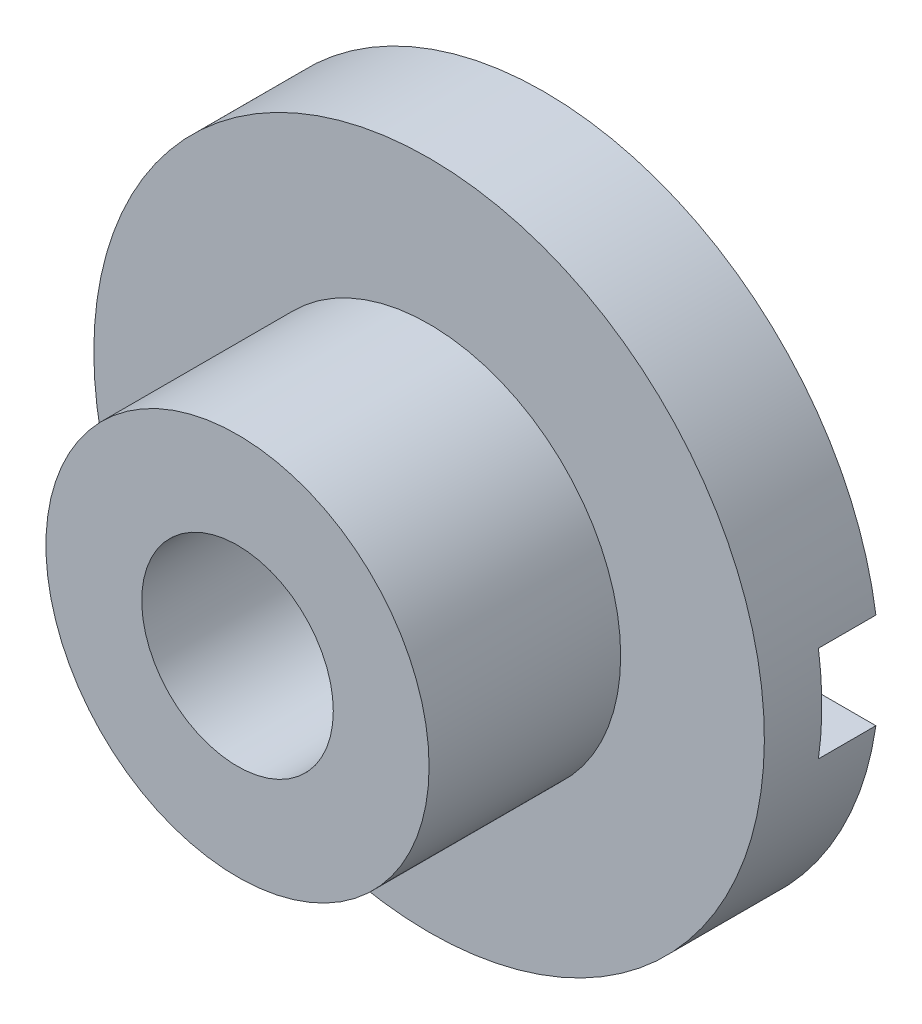
ISO-10303-21;
HEADER;
FILE_DESCRIPTION(('STEP AP214'),'2;1');
FILE_NAME('part.step','',(''),(''),'','','');
FILE_SCHEMA(('AUTOMOTIVE_DESIGN { 1 0 10303 214 1 1 1 1 }'));
ENDSEC;
DATA;
#1=APPLICATION_CONTEXT('core data for automotive mechanical design processes');
#2=APPLICATION_PROTOCOL_DEFINITION('international standard','automotive_design',2000,#1);
#3=PRODUCT_CONTEXT('',#1,'mechanical');
#4=PRODUCT('Part','Part','',(#3));
#5=PRODUCT_RELATED_PRODUCT_CATEGORY('part','',(#4));
#6=PRODUCT_DEFINITION_FORMATION('','',#4);
#7=PRODUCT_DEFINITION_CONTEXT('part definition',#1,'design');
#8=PRODUCT_DEFINITION('design','',#6,#7);
#9=PRODUCT_DEFINITION_SHAPE('','',#8);
#10=(LENGTH_UNIT() NAMED_UNIT(*) SI_UNIT(.MILLI.,.METRE.));
#11=(NAMED_UNIT(*) PLANE_ANGLE_UNIT() SI_UNIT($,.RADIAN.));
#12=(NAMED_UNIT(*) SI_UNIT($,.STERADIAN.) SOLID_ANGLE_UNIT());
#13=UNCERTAINTY_MEASURE_WITH_UNIT(LENGTH_MEASURE(1.E-05),#10,'distance_accuracy_value','');
#14=(GEOMETRIC_REPRESENTATION_CONTEXT(3) GLOBAL_UNCERTAINTY_ASSIGNED_CONTEXT((#13)) GLOBAL_UNIT_ASSIGNED_CONTEXT((#10,
#11,#12)) REPRESENTATION_CONTEXT('',''));
#15=CARTESIAN_POINT('',(0.,0.,0.));
#16=DIRECTION('',(0.,0.,1.));
#17=DIRECTION('',(1.,0.,0.));
#18=AXIS2_PLACEMENT_3D('',#15,#16,#17);
#19=CARTESIAN_POINT('',(0.,0.,-2.1));
#20=DIRECTION('',(0.,0.,-1.));
#21=DIRECTION('',(-1.,0.,0.));
#22=AXIS2_PLACEMENT_3D('',#19,#20,#21);
#23=PLANE('',#22);
#24=CARTESIAN_POINT('',(0.,0.,-2.1));
#25=DIRECTION('',(0.,0.,-1.));
#26=DIRECTION('',(-1.,0.,0.));
#27=AXIS2_PLACEMENT_3D('',#24,#25,#26);
#28=CIRCLE('',#27,3.5);
#29=CARTESIAN_POINT('',(3.03108891324554,1.75,-2.1));
#30=VERTEX_POINT('',#29);
#31=CARTESIAN_POINT('',(3.03108891324554,-1.75,-2.1));
#32=VERTEX_POINT('',#31);
#33=EDGE_CURVE('E12',#30,#32,#28,.T.);
#34=ORIENTED_EDGE('',*,*,#33,.F.);
#35=DIRECTION('',(-1.,0.,0.));
#36=VECTOR('',#35,1.);
#37=CARTESIAN_POINT('',(12.1243556529821,1.75,-2.1));
#38=LINE('',#37,#36);
#39=CARTESIAN_POINT('',(12.1243556529821,1.75,-2.1));
#40=VERTEX_POINT('',#39);
#41=EDGE_CURVE('E93',#40,#30,#38,.T.);
#42=ORIENTED_EDGE('',*,*,#41,.F.);
#43=CARTESIAN_POINT('',(0.,0.,-2.1));
#44=DIRECTION('',(0.,0.,-1.));
#45=DIRECTION('',(-1.,0.,0.));
#46=AXIS2_PLACEMENT_3D('',#43,#44,#45);
#47=CIRCLE('',#46,12.25);
#48=CARTESIAN_POINT('',(12.1243556529821,-1.75,-2.1));
#49=VERTEX_POINT('',#48);
#50=EDGE_CURVE('E134',#49,#40,#47,.F.);
#51=ORIENTED_EDGE('',*,*,#50,.F.);
#52=DIRECTION('',(1.,0.,0.));
#53=VECTOR('',#52,1.);
#54=CARTESIAN_POINT('',(12.1243556529821,-1.75,-2.1));
#55=LINE('',#54,#53);
#56=EDGE_CURVE('E106',#32,#49,#55,.T.);
#57=ORIENTED_EDGE('',*,*,#56,.F.);
#58=EDGE_LOOP('',(#34,#42,#51,#57));
#59=FACE_BOUND('',#58,.T.);
#60=ADVANCED_FACE('F35',(#59),#23,.T.);
#61=CARTESIAN_POINT('',(0.,0.,-4.2));
#62=DIRECTION('',(0.,0.,-1.));
#63=DIRECTION('',(-1.,0.,0.));
#64=AXIS2_PLACEMENT_3D('',#61,#62,#63);
#65=PLANE('',#64);
#66=DIRECTION('',(-1.,0.,0.));
#67=VECTOR('',#66,1.);
#68=CARTESIAN_POINT('',(12.1243556529821,-1.75,-4.2));
#69=LINE('',#68,#67);
#70=CARTESIAN_POINT('',(12.1243556529821,-1.75,-4.2));
#71=VERTEX_POINT('',#70);
#72=CARTESIAN_POINT('',(-12.1243556529821,-1.75,-4.2));
#73=VERTEX_POINT('',#72);
#74=EDGE_CURVE('E130',#71,#73,#69,.T.);
#75=ORIENTED_EDGE('',*,*,#74,.F.);
#76=CARTESIAN_POINT('',(0.,0.,-4.2));
#77=DIRECTION('',(0.,0.,-1.));
#78=DIRECTION('',(-1.,0.,0.));
#79=AXIS2_PLACEMENT_3D('',#76,#77,#78);
#80=CIRCLE('',#79,12.25);
#81=EDGE_CURVE('E113',#71,#73,#80,.T.);
#82=ORIENTED_EDGE('',*,*,#81,.T.);
#83=EDGE_LOOP('',(#75,#82));
#84=FACE_BOUND('',#83,.T.);
#85=ADVANCED_FACE('F177',(#84),#65,.T.);
#86=CARTESIAN_POINT('',(0.,0.,7.));
#87=DIRECTION('',(0.,0.,1.));
#88=DIRECTION('',(1.,0.,0.));
#89=AXIS2_PLACEMENT_3D('',#86,#87,#88);
#90=PLANE('',#89);
#91=CARTESIAN_POINT('',(0.,0.,7.));
#92=DIRECTION('',(0.,0.,1.));
#93=DIRECTION('',(1.,0.,0.));
#94=AXIS2_PLACEMENT_3D('',#91,#92,#93);
#95=CIRCLE('',#94,7.);
#96=CARTESIAN_POINT('',(7.,0.,7.));
#97=VERTEX_POINT('',#96);
#98=EDGE_CURVE('E153',#97,#97,#95,.T.);
#99=ORIENTED_EDGE('',*,*,#98,.T.);
#100=EDGE_LOOP('',(#99));
#101=FACE_BOUND('',#100,.T.);
#102=CARTESIAN_POINT('',(0.,0.,7.));
#103=DIRECTION('',(0.,0.,1.));
#104=DIRECTION('',(1.,0.,0.));
#105=AXIS2_PLACEMENT_3D('',#102,#103,#104);
#106=CIRCLE('',#105,3.5);
#107=CARTESIAN_POINT('',(3.5,0.,7.));
#108=VERTEX_POINT('',#107);
#109=EDGE_CURVE('E148',#108,#108,#106,.T.);
#110=ORIENTED_EDGE('',*,*,#109,.F.);
#111=EDGE_LOOP('',(#110));
#112=FACE_BOUND('',#111,.T.);
#113=ADVANCED_FACE('F157',(#101,#112),#90,.T.);
#114=CARTESIAN_POINT('',(0.,0.,7.));
#115=DIRECTION('',(0.,0.,-1.));
#116=DIRECTION('',(-1.,0.,0.));
#117=AXIS2_PLACEMENT_3D('',#114,#115,#116);
#118=CYLINDRICAL_SURFACE('',#117,7.);
#119=ORIENTED_EDGE('',*,*,#98,.F.);
#120=EDGE_LOOP('',(#119));
#121=FACE_BOUND('',#120,.T.);
#122=CARTESIAN_POINT('',(0.,0.,0.));
#123=DIRECTION('',(0.,0.,1.));
#124=DIRECTION('',(1.,0.,0.));
#125=AXIS2_PLACEMENT_3D('',#122,#123,#124);
#126=CIRCLE('',#125,7.);
#127=CARTESIAN_POINT('',(7.,0.,0.));
#128=VERTEX_POINT('',#127);
#129=EDGE_CURVE('E146',#128,#128,#126,.T.);
#130=ORIENTED_EDGE('',*,*,#129,.T.);
#131=EDGE_LOOP('',(#130));
#132=FACE_BOUND('',#131,.T.);
#133=ADVANCED_FACE('F37',(#121,#132),#118,.T.);
#134=CARTESIAN_POINT('',(0.,0.,7.));
#135=DIRECTION('',(0.,0.,-1.));
#136=DIRECTION('',(-1.,0.,0.));
#137=AXIS2_PLACEMENT_3D('',#134,#135,#136);
#138=CYLINDRICAL_SURFACE('',#137,3.5);
#139=ORIENTED_EDGE('',*,*,#109,.T.);
#140=EDGE_LOOP('',(#139));
#141=FACE_BOUND('',#140,.T.);
#142=CARTESIAN_POINT('',(0.,0.,-2.1));
#143=DIRECTION('',(0.,0.,1.));
#144=DIRECTION('',(1.,0.,0.));
#145=AXIS2_PLACEMENT_3D('',#142,#143,#144);
#146=CIRCLE('',#145,3.5);
#147=CARTESIAN_POINT('',(-3.03108891324554,1.75,-2.1));
#148=VERTEX_POINT('',#147);
#149=EDGE_CURVE('E90',#30,#148,#146,.T.);
#150=ORIENTED_EDGE('',*,*,#149,.F.);
#151=ORIENTED_EDGE('',*,*,#33,.T.);
#152=CARTESIAN_POINT('',(-3.03108891324554,-1.75,-2.1));
#153=VERTEX_POINT('',#152);
#154=EDGE_CURVE('E49',#153,#32,#146,.T.);
#155=ORIENTED_EDGE('',*,*,#154,.F.);
#156=EDGE_CURVE('E39',#153,#148,#28,.T.);
#157=ORIENTED_EDGE('',*,*,#156,.T.);
#158=EDGE_LOOP('',(#150,#151,#155,#157));
#159=FACE_BOUND('',#158,.T.);
#160=ADVANCED_FACE('F97',(#141,#159),#138,.F.);
#161=CARTESIAN_POINT('',(0.,0.,-4.2));
#162=DIRECTION('',(0.,0.,1.));
#163=DIRECTION('',(1.,0.,0.));
#164=AXIS2_PLACEMENT_3D('',#161,#162,#163);
#165=CYLINDRICAL_SURFACE('',#164,12.25);
#166=ORIENTED_EDGE('',*,*,#81,.F.);
#167=DIRECTION('',(0.,0.,-1.));
#168=VECTOR('',#167,1.);
#169=CARTESIAN_POINT('',(12.1243556529821,-1.75,24.7487373415292));
#170=LINE('',#169,#168);
#171=EDGE_CURVE('E135',#49,#71,#170,.T.);
#172=ORIENTED_EDGE('',*,*,#171,.F.);
#173=ORIENTED_EDGE('',*,*,#50,.T.);
#174=DIRECTION('',(0.,0.,-1.));
#175=VECTOR('',#174,1.);
#176=CARTESIAN_POINT('',(12.1243556529821,1.75,24.7487373415292));
#177=LINE('',#176,#175);
#178=CARTESIAN_POINT('',(12.1243556529821,1.75,-4.2));
#179=VERTEX_POINT('',#178);
#180=EDGE_CURVE('E110',#40,#179,#177,.T.);
#181=ORIENTED_EDGE('',*,*,#180,.T.);
#182=CARTESIAN_POINT('',(-12.1243556529821,1.75,-4.2));
#183=VERTEX_POINT('',#182);
#184=EDGE_CURVE('E142',#183,#179,#80,.T.);
#185=ORIENTED_EDGE('',*,*,#184,.F.);
#186=DIRECTION('',(0.,0.,-1.));
#187=VECTOR('',#186,1.);
#188=CARTESIAN_POINT('',(-12.1243556529821,1.75,24.7487373415292));
#189=LINE('',#188,#187);
#190=CARTESIAN_POINT('',(-12.1243556529821,1.75,-2.1));
#191=VERTEX_POINT('',#190);
#192=EDGE_CURVE('E57',#191,#183,#189,.T.);
#193=ORIENTED_EDGE('',*,*,#192,.F.);
#194=CARTESIAN_POINT('',(0.,0.,-2.1));
#195=DIRECTION('',(0.,0.,-1.));
#196=DIRECTION('',(-1.,0.,0.));
#197=AXIS2_PLACEMENT_3D('',#194,#195,#196);
#198=CIRCLE('',#197,12.25);
#199=CARTESIAN_POINT('',(-12.1243556529821,-1.75,-2.1));
#200=VERTEX_POINT('',#199);
#201=EDGE_CURVE('E117',#191,#200,#198,.F.);
#202=ORIENTED_EDGE('',*,*,#201,.T.);
#203=DIRECTION('',(0.,0.,-1.));
#204=VECTOR('',#203,1.);
#205=CARTESIAN_POINT('',(-12.1243556529821,-1.75,24.7487373415292));
#206=LINE('',#205,#204);
#207=EDGE_CURVE('E132',#200,#73,#206,.T.);
#208=ORIENTED_EDGE('',*,*,#207,.T.);
#209=EDGE_LOOP('',(#166,#172,#173,#181,#185,#193,#202,#208));
#210=FACE_BOUND('',#209,.T.);
#211=CARTESIAN_POINT('',(0.,0.,0.));
#212=DIRECTION('',(0.,0.,-1.));
#213=DIRECTION('',(-1.,0.,0.));
#214=AXIS2_PLACEMENT_3D('',#211,#212,#213);
#215=CIRCLE('',#214,12.25);
#216=CARTESIAN_POINT('',(-12.25,0.,0.));
#217=VERTEX_POINT('',#216);
#218=EDGE_CURVE('E111',#217,#217,#215,.T.);
#219=ORIENTED_EDGE('',*,*,#218,.T.);
#220=EDGE_LOOP('',(#219));
#221=FACE_BOUND('',#220,.T.);
#222=ADVANCED_FACE('F140',(#210,#221),#165,.T.);
#223=DIRECTION('',(1.,0.,0.));
#224=VECTOR('',#223,1.);
#225=CARTESIAN_POINT('',(12.1243556529821,1.75,-4.2));
#226=LINE('',#225,#224);
#227=EDGE_CURVE('E99',#183,#179,#226,.T.);
#228=ORIENTED_EDGE('',*,*,#227,.F.);
#229=ORIENTED_EDGE('',*,*,#184,.T.);
#230=EDGE_LOOP('',(#228,#229));
#231=FACE_BOUND('',#230,.T.);
#232=ADVANCED_FACE('F145',(#231),#65,.T.);
#233=CARTESIAN_POINT('',(0.,0.,0.));
#234=DIRECTION('',(0.,0.,-1.));
#235=DIRECTION('',(-1.,0.,0.));
#236=AXIS2_PLACEMENT_3D('',#233,#234,#235);
#237=PLANE('',#236);
#238=ORIENTED_EDGE('',*,*,#129,.F.);
#239=EDGE_LOOP('',(#238));
#240=FACE_BOUND('',#239,.T.);
#241=ORIENTED_EDGE('',*,*,#218,.F.);
#242=EDGE_LOOP('',(#241));
#243=FACE_BOUND('',#242,.T.);
#244=ADVANCED_FACE('F164',(#240,#243),#237,.F.);
#245=CARTESIAN_POINT('',(12.1243556529821,-1.75,24.7487373415292));
#246=DIRECTION('',(0.,-1.,0.));
#247=DIRECTION('',(0.,0.,-1.));
#248=AXIS2_PLACEMENT_3D('',#245,#246,#247);
#249=PLANE('',#248);
#250=EDGE_CURVE('E120',#200,#153,#55,.T.);
#251=ORIENTED_EDGE('',*,*,#250,.T.);
#252=EDGE_CURVE('E125',#153,#32,#55,.T.);
#253=ORIENTED_EDGE('',*,*,#252,.T.);
#254=ORIENTED_EDGE('',*,*,#56,.T.);
#255=ORIENTED_EDGE('',*,*,#171,.T.);
#256=ORIENTED_EDGE('',*,*,#74,.T.);
#257=ORIENTED_EDGE('',*,*,#207,.F.);
#258=EDGE_LOOP('',(#251,#253,#254,#255,#256,#257));
#259=FACE_BOUND('',#258,.T.);
#260=ADVANCED_FACE('F167',(#259),#249,.F.);
#261=CARTESIAN_POINT('',(12.1243556529821,1.75,24.7487373415292));
#262=DIRECTION('',(0.,1.,0.));
#263=DIRECTION('',(0.,0.,1.));
#264=AXIS2_PLACEMENT_3D('',#261,#262,#263);
#265=PLANE('',#264);
#266=ORIENTED_EDGE('',*,*,#41,.T.);
#267=EDGE_CURVE('E87',#30,#148,#38,.T.);
#268=ORIENTED_EDGE('',*,*,#267,.T.);
#269=EDGE_CURVE('E94',#148,#191,#38,.T.);
#270=ORIENTED_EDGE('',*,*,#269,.T.);
#271=ORIENTED_EDGE('',*,*,#192,.T.);
#272=ORIENTED_EDGE('',*,*,#227,.T.);
#273=ORIENTED_EDGE('',*,*,#180,.F.);
#274=EDGE_LOOP('',(#266,#268,#270,#271,#272,#273));
#275=FACE_BOUND('',#274,.T.);
#276=ADVANCED_FACE('F108',(#275),#265,.F.);
#277=ORIENTED_EDGE('',*,*,#156,.F.);
#278=ORIENTED_EDGE('',*,*,#250,.F.);
#279=ORIENTED_EDGE('',*,*,#201,.F.);
#280=ORIENTED_EDGE('',*,*,#269,.F.);
#281=EDGE_LOOP('',(#277,#278,#279,#280));
#282=FACE_BOUND('',#281,.T.);
#283=ADVANCED_FACE('F182',(#282),#23,.T.);
#284=CARTESIAN_POINT('',(0.,0.,-2.1));
#285=DIRECTION('',(0.,0.,1.));
#286=DIRECTION('',(1.,0.,0.));
#287=AXIS2_PLACEMENT_3D('',#284,#285,#286);
#288=PLANE('',#287);
#289=ORIENTED_EDGE('',*,*,#252,.F.);
#290=ORIENTED_EDGE('',*,*,#154,.T.);
#291=EDGE_LOOP('',(#289,#290));
#292=FACE_BOUND('',#291,.T.);
#293=ADVANCED_FACE('F190',(#292),#288,.T.);
#294=ORIENTED_EDGE('',*,*,#267,.F.);
#295=ORIENTED_EDGE('',*,*,#149,.T.);
#296=EDGE_LOOP('',(#294,#295));
#297=FACE_BOUND('',#296,.T.);
#298=ADVANCED_FACE('F89',(#297),#288,.T.);
#299=CLOSED_SHELL('',(#60,#85,#113,#133,#160,#222,#232,#244,#260,#276,#283,#293,#298));
#300=MANIFOLD_SOLID_BREP('B2',#299);
#301=ADVANCED_BREP_SHAPE_REPRESENTATION('',(#18,#300),#14);
#302=SHAPE_DEFINITION_REPRESENTATION(#9,#301);
ENDSEC;
END-ISO-10303-21;
